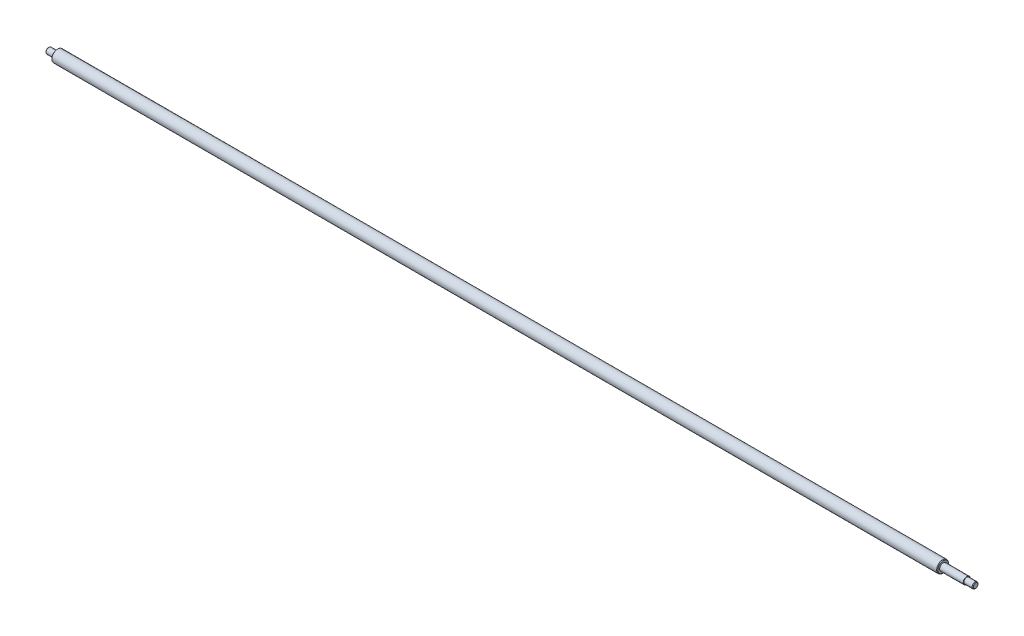
ISO-10303-21;
HEADER;
FILE_DESCRIPTION(('STEP AP214'),'2;1');
FILE_NAME('part.step','',(''),(''),'','','');
FILE_SCHEMA(('AUTOMOTIVE_DESIGN { 1 0 10303 214 1 1 1 1 }'));
ENDSEC;
DATA;
#1=APPLICATION_CONTEXT('core data for automotive mechanical design processes');
#2=APPLICATION_PROTOCOL_DEFINITION('international standard','automotive_design',2000,#1);
#3=PRODUCT_CONTEXT('',#1,'mechanical');
#4=PRODUCT('Part','Part','',(#3));
#5=PRODUCT_RELATED_PRODUCT_CATEGORY('part','',(#4));
#6=PRODUCT_DEFINITION_FORMATION('','',#4);
#7=PRODUCT_DEFINITION_CONTEXT('part definition',#1,'design');
#8=PRODUCT_DEFINITION('design','',#6,#7);
#9=PRODUCT_DEFINITION_SHAPE('','',#8);
#10=(LENGTH_UNIT() NAMED_UNIT(*) SI_UNIT(.MILLI.,.METRE.));
#11=(NAMED_UNIT(*) PLANE_ANGLE_UNIT() SI_UNIT($,.RADIAN.));
#12=(NAMED_UNIT(*) SI_UNIT($,.STERADIAN.) SOLID_ANGLE_UNIT());
#13=UNCERTAINTY_MEASURE_WITH_UNIT(LENGTH_MEASURE(1.E-05),#10,'distance_accuracy_value','');
#14=(GEOMETRIC_REPRESENTATION_CONTEXT(3) GLOBAL_UNCERTAINTY_ASSIGNED_CONTEXT((#13)) GLOBAL_UNIT_ASSIGNED_CONTEXT((#10,
#11,#12)) REPRESENTATION_CONTEXT('',''));
#15=CARTESIAN_POINT('',(0.,0.,0.));
#16=DIRECTION('',(0.,0.,1.));
#17=DIRECTION('',(1.,0.,0.));
#18=AXIS2_PLACEMENT_3D('',#15,#16,#17);
#19=CARTESIAN_POINT('',(1540.,0.,0.));
#20=DIRECTION('',(1.,0.,0.));
#21=DIRECTION('',(0.,0.,-1.));
#22=AXIS2_PLACEMENT_3D('',#19,#20,#21);
#23=PLANE('',#22);
#24=CARTESIAN_POINT('',(1540.,0.,0.));
#25=DIRECTION('',(1.,0.,0.));
#26=DIRECTION('',(0.,0.,-1.));
#27=AXIS2_PLACEMENT_3D('',#24,#25,#26);
#28=CIRCLE('',#27,6.);
#29=CARTESIAN_POINT('',(1540.,0.,-6.));
#30=VERTEX_POINT('',#29);
#31=EDGE_CURVE('E69',#30,#30,#28,.T.);
#32=ORIENTED_EDGE('',*,*,#31,.T.);
#33=EDGE_LOOP('',(#32));
#34=FACE_BOUND('',#33,.T.);
#35=CARTESIAN_POINT('',(1540.,0.,0.));
#36=DIRECTION('',(1.,0.,0.));
#37=DIRECTION('',(0.,0.,-1.));
#38=AXIS2_PLACEMENT_3D('',#35,#36,#37);
#39=CIRCLE('',#38,5.);
#40=CARTESIAN_POINT('',(1540.,0.,-5.));
#41=VERTEX_POINT('',#40);
#42=EDGE_CURVE('E73',#41,#41,#39,.T.);
#43=ORIENTED_EDGE('',*,*,#42,.F.);
#44=EDGE_LOOP('',(#43));
#45=FACE_BOUND('',#44,.T.);
#46=ADVANCED_FACE('F34',(#34,#45),#23,.T.);
#47=CARTESIAN_POINT('',(1500.,0.,0.));
#48=DIRECTION('',(1.,0.,0.));
#49=DIRECTION('',(0.,0.,-1.));
#50=AXIS2_PLACEMENT_3D('',#47,#48,#49);
#51=PLANE('',#50);
#52=CARTESIAN_POINT('',(1500.,0.,0.));
#53=DIRECTION('',(1.,0.,0.));
#54=DIRECTION('',(0.,0.,-1.));
#55=AXIS2_PLACEMENT_3D('',#52,#53,#54);
#56=CIRCLE('',#55,8.9999999999999);
#57=CARTESIAN_POINT('',(1500.,0.,-8.9999999999999));
#58=VERTEX_POINT('',#57);
#59=EDGE_CURVE('E63',#58,#58,#56,.T.);
#60=ORIENTED_EDGE('',*,*,#59,.T.);
#61=EDGE_LOOP('',(#60));
#62=FACE_BOUND('',#61,.T.);
#63=CARTESIAN_POINT('',(1500.,0.,0.));
#64=DIRECTION('',(1.,0.,0.));
#65=DIRECTION('',(0.,0.,-1.));
#66=AXIS2_PLACEMENT_3D('',#63,#64,#65);
#67=CIRCLE('',#66,6.);
#68=CARTESIAN_POINT('',(1500.,0.,-6.));
#69=VERTEX_POINT('',#68);
#70=EDGE_CURVE('E70',#69,#69,#67,.T.);
#71=ORIENTED_EDGE('',*,*,#70,.F.);
#72=EDGE_LOOP('',(#71));
#73=FACE_BOUND('',#72,.T.);
#74=ADVANCED_FACE('F82',(#62,#73),#51,.T.);
#75=CARTESIAN_POINT('',(0.,0.,0.));
#76=DIRECTION('',(1.,0.,0.));
#77=DIRECTION('',(0.,0.,-1.));
#78=AXIS2_PLACEMENT_3D('',#75,#76,#77);
#79=PLANE('',#78);
#80=CARTESIAN_POINT('',(0.,0.,0.));
#81=DIRECTION('',(1.,0.,0.));
#82=DIRECTION('',(0.,0.,-1.));
#83=AXIS2_PLACEMENT_3D('',#80,#81,#82);
#84=CIRCLE('',#83,8.99999999999967);
#85=CARTESIAN_POINT('',(0.,0.,-8.99999999999967));
#86=VERTEX_POINT('',#85);
#87=EDGE_CURVE('E10',#86,#86,#84,.F.);
#88=ORIENTED_EDGE('',*,*,#87,.T.);
#89=EDGE_LOOP('',(#88));
#90=FACE_BOUND('',#89,.T.);
#91=CARTESIAN_POINT('',(0.,0.,0.));
#92=DIRECTION('',(1.,0.,0.));
#93=DIRECTION('',(0.,0.,-1.));
#94=AXIS2_PLACEMENT_3D('',#91,#92,#93);
#95=CIRCLE('',#94,5.);
#96=CARTESIAN_POINT('',(0.,0.,-5.));
#97=VERTEX_POINT('',#96);
#98=EDGE_CURVE('E66',#97,#97,#95,.F.);
#99=ORIENTED_EDGE('',*,*,#98,.F.);
#100=EDGE_LOOP('',(#99));
#101=FACE_BOUND('',#100,.T.);
#102=ADVANCED_FACE('F90',(#90,#101),#79,.F.);
#103=CARTESIAN_POINT('',(1500.,0.,0.));
#104=DIRECTION('',(-1.,0.,0.));
#105=DIRECTION('',(0.,0.,1.));
#106=AXIS2_PLACEMENT_3D('',#103,#104,#105);
#107=CYLINDRICAL_SURFACE('',#106,10.);
#108=CARTESIAN_POINT('',(1.00000000000033,0.,0.));
#109=DIRECTION('',(1.,0.,0.));
#110=DIRECTION('',(0.,0.,-1.));
#111=AXIS2_PLACEMENT_3D('',#108,#109,#110);
#112=CIRCLE('',#111,10.);
#113=CARTESIAN_POINT('',(1.00000000000033,0.,-10.));
#114=VERTEX_POINT('',#113);
#115=EDGE_CURVE('E41',#114,#114,#112,.T.);
#116=ORIENTED_EDGE('',*,*,#115,.T.);
#117=EDGE_LOOP('',(#116));
#118=FACE_BOUND('',#117,.T.);
#119=CARTESIAN_POINT('',(1499.,0.,0.));
#120=DIRECTION('',(1.,0.,0.));
#121=DIRECTION('',(0.,0.,-1.));
#122=AXIS2_PLACEMENT_3D('',#119,#120,#121);
#123=CIRCLE('',#122,10.);
#124=CARTESIAN_POINT('',(1499.,0.,-10.));
#125=VERTEX_POINT('',#124);
#126=EDGE_CURVE('E60',#125,#125,#123,.F.);
#127=ORIENTED_EDGE('',*,*,#126,.T.);
#128=EDGE_LOOP('',(#127));
#129=FACE_BOUND('',#128,.T.);
#130=ADVANCED_FACE('F105',(#118,#129),#107,.T.);
#131=CARTESIAN_POINT('',(-15.,0.,0.));
#132=DIRECTION('',(1.,0.,0.));
#133=DIRECTION('',(0.,0.,-1.));
#134=AXIS2_PLACEMENT_3D('',#131,#132,#133);
#135=CYLINDRICAL_SURFACE('',#134,5.);
#136=CARTESIAN_POINT('',(-14.,0.,0.));
#137=DIRECTION('',(-1.,0.,0.));
#138=DIRECTION('',(0.,0.,1.));
#139=AXIS2_PLACEMENT_3D('',#136,#137,#138);
#140=CIRCLE('',#139,5.);
#141=CARTESIAN_POINT('',(-14.,0.,5.));
#142=VERTEX_POINT('',#141);
#143=EDGE_CURVE('E45',#142,#142,#140,.F.);
#144=ORIENTED_EDGE('',*,*,#143,.T.);
#145=EDGE_LOOP('',(#144));
#146=FACE_BOUND('',#145,.T.);
#147=ORIENTED_EDGE('',*,*,#98,.T.);
#148=EDGE_LOOP('',(#147));
#149=FACE_BOUND('',#148,.T.);
#150=ADVANCED_FACE('F102',(#146,#149),#135,.T.);
#151=CARTESIAN_POINT('',(-15.,0.,0.));
#152=DIRECTION('',(-1.,0.,0.));
#153=DIRECTION('',(0.,0.,1.));
#154=AXIS2_PLACEMENT_3D('',#151,#152,#153);
#155=PLANE('',#154);
#156=CARTESIAN_POINT('',(-15.,0.,0.));
#157=DIRECTION('',(-1.,0.,0.));
#158=DIRECTION('',(0.,0.,1.));
#159=AXIS2_PLACEMENT_3D('',#156,#157,#158);
#160=CIRCLE('',#159,4.);
#161=CARTESIAN_POINT('',(-15.,0.,4.));
#162=VERTEX_POINT('',#161);
#163=EDGE_CURVE('E49',#162,#162,#160,.T.);
#164=ORIENTED_EDGE('',*,*,#163,.T.);
#165=EDGE_LOOP('',(#164));
#166=FACE_BOUND('',#165,.T.);
#167=ADVANCED_FACE('F98',(#166),#155,.T.);
#168=CARTESIAN_POINT('',(1540.,0.,0.));
#169=DIRECTION('',(-1.,0.,0.));
#170=DIRECTION('',(0.,0.,1.));
#171=AXIS2_PLACEMENT_3D('',#168,#169,#170);
#172=CYLINDRICAL_SURFACE('',#171,6.);
#173=ORIENTED_EDGE('',*,*,#31,.F.);
#174=EDGE_LOOP('',(#173));
#175=FACE_BOUND('',#174,.T.);
#176=ORIENTED_EDGE('',*,*,#70,.T.);
#177=EDGE_LOOP('',(#176));
#178=FACE_BOUND('',#177,.T.);
#179=ADVANCED_FACE('F96',(#175,#178),#172,.T.);
#180=CARTESIAN_POINT('',(1555.,0.,0.));
#181=DIRECTION('',(-1.,0.,0.));
#182=DIRECTION('',(0.,0.,1.));
#183=AXIS2_PLACEMENT_3D('',#180,#181,#182);
#184=CYLINDRICAL_SURFACE('',#183,5.);
#185=CARTESIAN_POINT('',(1554.,0.,0.));
#186=DIRECTION('',(1.,0.,0.));
#187=DIRECTION('',(0.,0.,-1.));
#188=AXIS2_PLACEMENT_3D('',#185,#186,#187);
#189=CIRCLE('',#188,5.);
#190=CARTESIAN_POINT('',(1554.,0.,-5.));
#191=VERTEX_POINT('',#190);
#192=EDGE_CURVE('E54',#191,#191,#189,.F.);
#193=ORIENTED_EDGE('',*,*,#192,.T.);
#194=EDGE_LOOP('',(#193));
#195=FACE_BOUND('',#194,.T.);
#196=ORIENTED_EDGE('',*,*,#42,.T.);
#197=EDGE_LOOP('',(#196));
#198=FACE_BOUND('',#197,.T.);
#199=ADVANCED_FACE('F79',(#195,#198),#184,.T.);
#200=CARTESIAN_POINT('',(1555.,0.,0.));
#201=DIRECTION('',(1.,0.,0.));
#202=DIRECTION('',(0.,0.,-1.));
#203=AXIS2_PLACEMENT_3D('',#200,#201,#202);
#204=PLANE('',#203);
#205=CARTESIAN_POINT('',(1555.,0.,0.));
#206=DIRECTION('',(1.,0.,0.));
#207=DIRECTION('',(0.,0.,-1.));
#208=AXIS2_PLACEMENT_3D('',#205,#206,#207);
#209=CIRCLE('',#208,4.);
#210=CARTESIAN_POINT('',(1555.,0.,-4.));
#211=VERTEX_POINT('',#210);
#212=EDGE_CURVE('E57',#211,#211,#209,.T.);
#213=ORIENTED_EDGE('',*,*,#212,.T.);
#214=EDGE_LOOP('',(#213));
#215=FACE_BOUND('',#214,.T.);
#216=ADVANCED_FACE('F116',(#215),#204,.T.);
#217=CARTESIAN_POINT('',(1500.,0.,0.));
#218=DIRECTION('',(-1.,0.,0.));
#219=DIRECTION('',(0.,0.,1.));
#220=AXIS2_PLACEMENT_3D('',#217,#218,#219);
#221=CONICAL_SURFACE('',#220,8.9999999999999,0.785398163397444);
#222=ORIENTED_EDGE('',*,*,#126,.F.);
#223=EDGE_LOOP('',(#222));
#224=FACE_BOUND('',#223,.T.);
#225=ORIENTED_EDGE('',*,*,#59,.F.);
#226=EDGE_LOOP('',(#225));
#227=FACE_BOUND('',#226,.T.);
#228=ADVANCED_FACE('F112',(#224,#227),#221,.T.);
#229=CARTESIAN_POINT('',(1555.,0.,0.));
#230=DIRECTION('',(-1.,0.,0.));
#231=DIRECTION('',(0.,0.,1.));
#232=AXIS2_PLACEMENT_3D('',#229,#230,#231);
#233=CONICAL_SURFACE('',#232,4.,0.78539816339739);
#234=ORIENTED_EDGE('',*,*,#192,.F.);
#235=EDGE_LOOP('',(#234));
#236=FACE_BOUND('',#235,.T.);
#237=ORIENTED_EDGE('',*,*,#212,.F.);
#238=EDGE_LOOP('',(#237));
#239=FACE_BOUND('',#238,.T.);
#240=ADVANCED_FACE('F115',(#236,#239),#233,.T.);
#241=CARTESIAN_POINT('',(-15.,0.,0.));
#242=DIRECTION('',(1.,0.,0.));
#243=DIRECTION('',(0.,0.,-1.));
#244=AXIS2_PLACEMENT_3D('',#241,#242,#243);
#245=CONICAL_SURFACE('',#244,4.,0.785398163397439);
#246=ORIENTED_EDGE('',*,*,#143,.F.);
#247=EDGE_LOOP('',(#246));
#248=FACE_BOUND('',#247,.T.);
#249=ORIENTED_EDGE('',*,*,#163,.F.);
#250=EDGE_LOOP('',(#249));
#251=FACE_BOUND('',#250,.T.);
#252=ADVANCED_FACE('F119',(#248,#251),#245,.T.);
#253=CARTESIAN_POINT('',(1.00000000000033,0.,0.));
#254=DIRECTION('',(1.,0.,0.));
#255=DIRECTION('',(0.,0.,-1.));
#256=AXIS2_PLACEMENT_3D('',#253,#254,#255);
#257=CONICAL_SURFACE('',#256,10.,0.785398163397444);
#258=ORIENTED_EDGE('',*,*,#87,.F.);
#259=EDGE_LOOP('',(#258));
#260=FACE_BOUND('',#259,.T.);
#261=ORIENTED_EDGE('',*,*,#115,.F.);
#262=EDGE_LOOP('',(#261));
#263=FACE_BOUND('',#262,.T.);
#264=ADVANCED_FACE('F36',(#260,#263),#257,.T.);
#265=CLOSED_SHELL('',(#46,#74,#102,#130,#150,#167,#179,#199,#216,#228,#240,#252,#264));
#266=MANIFOLD_SOLID_BREP('B2',#265);
#267=ADVANCED_BREP_SHAPE_REPRESENTATION('',(#18,#266),#14);
#268=SHAPE_DEFINITION_REPRESENTATION(#9,#267);
ENDSEC;
END-ISO-10303-21;
